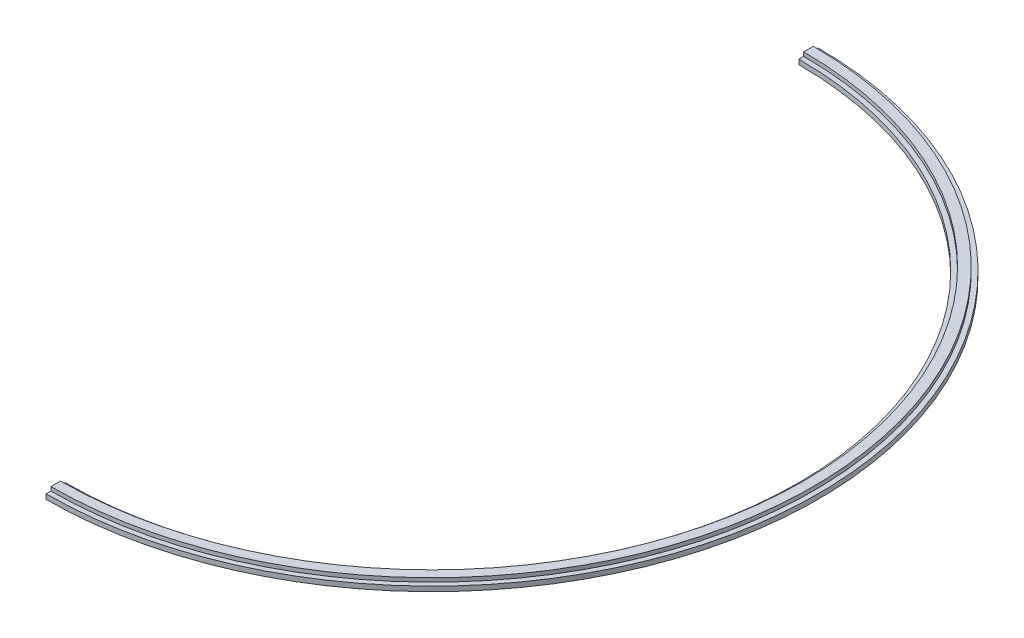
ISO-10303-21;
HEADER;
FILE_DESCRIPTION(('STEP AP214'),'2;1');
FILE_NAME('part.step','',(''),(''),'','','');
FILE_SCHEMA(('AUTOMOTIVE_DESIGN { 1 0 10303 214 1 1 1 1 }'));
ENDSEC;
DATA;
#1=APPLICATION_CONTEXT('core data for automotive mechanical design processes');
#2=APPLICATION_PROTOCOL_DEFINITION('international standard','automotive_design',2000,#1);
#3=PRODUCT_CONTEXT('',#1,'mechanical');
#4=PRODUCT('Part','Part','',(#3));
#5=PRODUCT_RELATED_PRODUCT_CATEGORY('part','',(#4));
#6=PRODUCT_DEFINITION_FORMATION('','',#4);
#7=PRODUCT_DEFINITION_CONTEXT('part definition',#1,'design');
#8=PRODUCT_DEFINITION('design','',#6,#7);
#9=PRODUCT_DEFINITION_SHAPE('','',#8);
#10=(LENGTH_UNIT() NAMED_UNIT(*) SI_UNIT(.MILLI.,.METRE.));
#11=(NAMED_UNIT(*) PLANE_ANGLE_UNIT() SI_UNIT($,.RADIAN.));
#12=(NAMED_UNIT(*) SI_UNIT($,.STERADIAN.) SOLID_ANGLE_UNIT());
#13=UNCERTAINTY_MEASURE_WITH_UNIT(LENGTH_MEASURE(1.E-05),#10,'distance_accuracy_value','');
#14=(GEOMETRIC_REPRESENTATION_CONTEXT(3) GLOBAL_UNCERTAINTY_ASSIGNED_CONTEXT((#13)) GLOBAL_UNIT_ASSIGNED_CONTEXT((#10,
#11,#12)) REPRESENTATION_CONTEXT('',''));
#15=CARTESIAN_POINT('',(0.,0.,0.));
#16=DIRECTION('',(0.,0.,1.));
#17=DIRECTION('',(1.,0.,0.));
#18=AXIS2_PLACEMENT_3D('',#15,#16,#17);
#19=CARTESIAN_POINT('',(0.,50.,0.));
#20=DIRECTION('',(0.,1.,0.));
#21=DIRECTION('',(0.,0.,1.));
#22=AXIS2_PLACEMENT_3D('',#19,#20,#21);
#23=PLANE('',#22);
#24=DIRECTION('',(0.,0.,1.));
#25=VECTOR('',#24,1.);
#26=CARTESIAN_POINT('',(0.,50.,0.));
#27=LINE('',#26,#25);
#28=CARTESIAN_POINT('',(0.,50.,3800.));
#29=VERTEX_POINT('',#28);
#30=CARTESIAN_POINT('',(0.,50.,3850.));
#31=VERTEX_POINT('',#30);
#32=EDGE_CURVE('E139',#29,#31,#27,.T.);
#33=ORIENTED_EDGE('',*,*,#32,.T.);
#34=CARTESIAN_POINT('',(0.,50.,0.));
#35=DIRECTION('',(0.,1.,0.));
#36=DIRECTION('',(0.,0.,1.));
#37=AXIS2_PLACEMENT_3D('',#34,#35,#36);
#38=CIRCLE('',#37,3850.);
#39=CARTESIAN_POINT('',(0.,50.,-3850.));
#40=VERTEX_POINT('',#39);
#41=EDGE_CURVE('E50',#31,#40,#38,.T.);
#42=ORIENTED_EDGE('',*,*,#41,.T.);
#43=CARTESIAN_POINT('',(0.,50.,-3800.));
#44=VERTEX_POINT('',#43);
#45=EDGE_CURVE('E142',#40,#44,#27,.T.);
#46=ORIENTED_EDGE('',*,*,#45,.T.);
#47=CARTESIAN_POINT('',(0.,50.,0.));
#48=DIRECTION('',(0.,1.,0.));
#49=DIRECTION('',(0.,0.,1.));
#50=AXIS2_PLACEMENT_3D('',#47,#48,#49);
#51=CIRCLE('',#50,3800.);
#52=EDGE_CURVE('E134',#29,#44,#51,.T.);
#53=ORIENTED_EDGE('',*,*,#52,.F.);
#54=EDGE_LOOP('',(#33,#42,#46,#53));
#55=FACE_BOUND('',#54,.T.);
#56=ADVANCED_FACE('F35',(#55),#23,.T.);
#57=CARTESIAN_POINT('',(0.,50.,0.));
#58=DIRECTION('',(0.,-1.,0.));
#59=DIRECTION('',(0.,0.,-1.));
#60=AXIS2_PLACEMENT_3D('',#57,#58,#59);
#61=CYLINDRICAL_SURFACE('',#60,3800.);
#62=CARTESIAN_POINT('',(0.,0.,0.));
#63=DIRECTION('',(0.,1.,0.));
#64=DIRECTION('',(0.,0.,1.));
#65=AXIS2_PLACEMENT_3D('',#62,#63,#64);
#66=CIRCLE('',#65,3800.);
#67=CARTESIAN_POINT('',(0.,0.,3800.));
#68=VERTEX_POINT('',#67);
#69=CARTESIAN_POINT('',(0.,0.,-3800.));
#70=VERTEX_POINT('',#69);
#71=EDGE_CURVE('E107',#68,#70,#66,.T.);
#72=ORIENTED_EDGE('',*,*,#71,.F.);
#73=DIRECTION('',(0.,-1.,0.));
#74=VECTOR('',#73,1.);
#75=CARTESIAN_POINT('',(0.,50.,3800.));
#76=LINE('',#75,#74);
#77=EDGE_CURVE('E11',#29,#68,#76,.T.);
#78=ORIENTED_EDGE('',*,*,#77,.F.);
#79=ORIENTED_EDGE('',*,*,#52,.T.);
#80=DIRECTION('',(0.,-1.,0.));
#81=VECTOR('',#80,1.);
#82=CARTESIAN_POINT('',(0.,50.,-3800.));
#83=LINE('',#82,#81);
#84=EDGE_CURVE('E151',#44,#70,#83,.T.);
#85=ORIENTED_EDGE('',*,*,#84,.T.);
#86=EDGE_LOOP('',(#72,#78,#79,#85));
#87=FACE_BOUND('',#86,.T.);
#88=ADVANCED_FACE('F37',(#87),#61,.F.);
#89=CARTESIAN_POINT('',(0.,50.,0.));
#90=DIRECTION('',(1.,0.,0.));
#91=DIRECTION('',(0.,0.,-1.));
#92=AXIS2_PLACEMENT_3D('',#89,#90,#91);
#93=PLANE('',#92);
#94=DIRECTION('',(0.,0.,1.));
#95=VECTOR('',#94,1.);
#96=CARTESIAN_POINT('',(0.,0.,0.));
#97=LINE('',#96,#95);
#98=CARTESIAN_POINT('',(0.,0.,4000.));
#99=VERTEX_POINT('',#98);
#100=EDGE_CURVE('E147',#68,#99,#97,.T.);
#101=ORIENTED_EDGE('',*,*,#100,.T.);
#102=DIRECTION('',(0.,-1.,0.));
#103=VECTOR('',#102,1.);
#104=CARTESIAN_POINT('',(0.,50.,4000.));
#105=LINE('',#104,#103);
#106=CARTESIAN_POINT('',(0.,50.,4000.));
#107=VERTEX_POINT('',#106);
#108=EDGE_CURVE('E43',#107,#99,#105,.T.);
#109=ORIENTED_EDGE('',*,*,#108,.F.);
#110=CARTESIAN_POINT('',(0.,50.,3950.));
#111=VERTEX_POINT('',#110);
#112=EDGE_CURVE('E137',#111,#107,#27,.T.);
#113=ORIENTED_EDGE('',*,*,#112,.F.);
#114=DIRECTION('',(0.,-1.,0.));
#115=VECTOR('',#114,1.);
#116=CARTESIAN_POINT('',(0.,90.,3950.));
#117=LINE('',#116,#115);
#118=CARTESIAN_POINT('',(0.,90.,3950.));
#119=VERTEX_POINT('',#118);
#120=EDGE_CURVE('E108',#119,#111,#117,.T.);
#121=ORIENTED_EDGE('',*,*,#120,.F.);
#122=DIRECTION('',(0.,0.,1.));
#123=VECTOR('',#122,1.);
#124=CARTESIAN_POINT('',(0.,90.,0.));
#125=LINE('',#124,#123);
#126=CARTESIAN_POINT('',(0.,90.,3850.));
#127=VERTEX_POINT('',#126);
#128=EDGE_CURVE('E111',#127,#119,#125,.T.);
#129=ORIENTED_EDGE('',*,*,#128,.F.);
#130=DIRECTION('',(0.,-1.,0.));
#131=VECTOR('',#130,1.);
#132=CARTESIAN_POINT('',(0.,90.,3850.));
#133=LINE('',#132,#131);
#134=EDGE_CURVE('E99',#127,#31,#133,.T.);
#135=ORIENTED_EDGE('',*,*,#134,.T.);
#136=ORIENTED_EDGE('',*,*,#32,.F.);
#137=ORIENTED_EDGE('',*,*,#77,.T.);
#138=EDGE_LOOP('',(#101,#109,#113,#121,#129,#135,#136,#137));
#139=FACE_BOUND('',#138,.T.);
#140=ADVANCED_FACE('F112',(#139),#93,.F.);
#141=CARTESIAN_POINT('',(0.,50.,0.));
#142=DIRECTION('',(0.,-1.,0.));
#143=DIRECTION('',(0.,0.,-1.));
#144=AXIS2_PLACEMENT_3D('',#141,#142,#143);
#145=CYLINDRICAL_SURFACE('',#144,4000.);
#146=CARTESIAN_POINT('',(0.,0.,0.));
#147=DIRECTION('',(0.,1.,0.));
#148=DIRECTION('',(0.,0.,1.));
#149=AXIS2_PLACEMENT_3D('',#146,#147,#148);
#150=CIRCLE('',#149,4000.);
#151=CARTESIAN_POINT('',(0.,0.,-4000.));
#152=VERTEX_POINT('',#151);
#153=EDGE_CURVE('E149',#99,#152,#150,.T.);
#154=ORIENTED_EDGE('',*,*,#153,.T.);
#155=DIRECTION('',(0.,-1.,0.));
#156=VECTOR('',#155,1.);
#157=CARTESIAN_POINT('',(0.,50.,-4000.));
#158=LINE('',#157,#156);
#159=CARTESIAN_POINT('',(0.,50.,-4000.));
#160=VERTEX_POINT('',#159);
#161=EDGE_CURVE('E153',#160,#152,#158,.T.);
#162=ORIENTED_EDGE('',*,*,#161,.F.);
#163=CARTESIAN_POINT('',(0.,50.,0.));
#164=DIRECTION('',(0.,1.,0.));
#165=DIRECTION('',(0.,0.,1.));
#166=AXIS2_PLACEMENT_3D('',#163,#164,#165);
#167=CIRCLE('',#166,4000.);
#168=EDGE_CURVE('E141',#107,#160,#167,.T.);
#169=ORIENTED_EDGE('',*,*,#168,.F.);
#170=ORIENTED_EDGE('',*,*,#108,.T.);
#171=EDGE_LOOP('',(#154,#162,#169,#170));
#172=FACE_BOUND('',#171,.T.);
#173=ADVANCED_FACE('F160',(#172),#145,.T.);
#174=EDGE_CURVE('E138',#152,#70,#97,.T.);
#175=ORIENTED_EDGE('',*,*,#174,.T.);
#176=ORIENTED_EDGE('',*,*,#84,.F.);
#177=ORIENTED_EDGE('',*,*,#45,.F.);
#178=DIRECTION('',(0.,-1.,0.));
#179=VECTOR('',#178,1.);
#180=CARTESIAN_POINT('',(0.,90.,-3850.));
#181=LINE('',#180,#179);
#182=CARTESIAN_POINT('',(0.,90.,-3850.));
#183=VERTEX_POINT('',#182);
#184=EDGE_CURVE('E127',#183,#40,#181,.T.);
#185=ORIENTED_EDGE('',*,*,#184,.F.);
#186=DIRECTION('',(0.,0.,1.));
#187=VECTOR('',#186,1.);
#188=CARTESIAN_POINT('',(0.,90.,0.));
#189=LINE('',#188,#187);
#190=CARTESIAN_POINT('',(0.,90.,-3950.));
#191=VERTEX_POINT('',#190);
#192=EDGE_CURVE('E120',#191,#183,#189,.T.);
#193=ORIENTED_EDGE('',*,*,#192,.F.);
#194=DIRECTION('',(0.,-1.,0.));
#195=VECTOR('',#194,1.);
#196=CARTESIAN_POINT('',(0.,90.,-3950.));
#197=LINE('',#196,#195);
#198=CARTESIAN_POINT('',(0.,50.,-3950.));
#199=VERTEX_POINT('',#198);
#200=EDGE_CURVE('E130',#191,#199,#197,.T.);
#201=ORIENTED_EDGE('',*,*,#200,.T.);
#202=EDGE_CURVE('E143',#160,#199,#27,.T.);
#203=ORIENTED_EDGE('',*,*,#202,.F.);
#204=ORIENTED_EDGE('',*,*,#161,.T.);
#205=EDGE_LOOP('',(#175,#176,#177,#185,#193,#201,#203,#204));
#206=FACE_BOUND('',#205,.T.);
#207=ADVANCED_FACE('F170',(#206),#93,.F.);
#208=CARTESIAN_POINT('',(0.,50.,0.));
#209=DIRECTION('',(0.,1.,0.));
#210=DIRECTION('',(0.,0.,1.));
#211=AXIS2_PLACEMENT_3D('',#208,#209,#210);
#212=CIRCLE('',#211,3950.);
#213=EDGE_CURVE('E58',#111,#199,#212,.T.);
#214=ORIENTED_EDGE('',*,*,#213,.F.);
#215=ORIENTED_EDGE('',*,*,#112,.T.);
#216=ORIENTED_EDGE('',*,*,#168,.T.);
#217=ORIENTED_EDGE('',*,*,#202,.T.);
#218=EDGE_LOOP('',(#214,#215,#216,#217));
#219=FACE_BOUND('',#218,.T.);
#220=ADVANCED_FACE('F173',(#219),#23,.T.);
#221=CARTESIAN_POINT('',(0.,0.,0.));
#222=DIRECTION('',(0.,1.,0.));
#223=DIRECTION('',(0.,0.,1.));
#224=AXIS2_PLACEMENT_3D('',#221,#222,#223);
#225=PLANE('',#224);
#226=ORIENTED_EDGE('',*,*,#71,.T.);
#227=ORIENTED_EDGE('',*,*,#174,.F.);
#228=ORIENTED_EDGE('',*,*,#153,.F.);
#229=ORIENTED_EDGE('',*,*,#100,.F.);
#230=EDGE_LOOP('',(#226,#227,#228,#229));
#231=FACE_BOUND('',#230,.T.);
#232=ADVANCED_FACE('F165',(#231),#225,.F.);
#233=CARTESIAN_POINT('',(0.,90.,0.));
#234=DIRECTION('',(0.,-1.,0.));
#235=DIRECTION('',(0.,0.,-1.));
#236=AXIS2_PLACEMENT_3D('',#233,#234,#235);
#237=CYLINDRICAL_SURFACE('',#236,3850.);
#238=ORIENTED_EDGE('',*,*,#41,.F.);
#239=ORIENTED_EDGE('',*,*,#134,.F.);
#240=CARTESIAN_POINT('',(0.,90.,0.));
#241=DIRECTION('',(0.,1.,0.));
#242=DIRECTION('',(0.,0.,1.));
#243=AXIS2_PLACEMENT_3D('',#240,#241,#242);
#244=CIRCLE('',#243,3850.);
#245=EDGE_CURVE('E104',#127,#183,#244,.T.);
#246=ORIENTED_EDGE('',*,*,#245,.T.);
#247=ORIENTED_EDGE('',*,*,#184,.T.);
#248=EDGE_LOOP('',(#238,#239,#246,#247));
#249=FACE_BOUND('',#248,.T.);
#250=ADVANCED_FACE('F101',(#249),#237,.F.);
#251=CARTESIAN_POINT('',(0.,90.,0.));
#252=DIRECTION('',(0.,-1.,0.));
#253=DIRECTION('',(0.,0.,-1.));
#254=AXIS2_PLACEMENT_3D('',#251,#252,#253);
#255=CYLINDRICAL_SURFACE('',#254,3950.);
#256=ORIENTED_EDGE('',*,*,#213,.T.);
#257=ORIENTED_EDGE('',*,*,#200,.F.);
#258=CARTESIAN_POINT('',(0.,90.,0.));
#259=DIRECTION('',(0.,1.,0.));
#260=DIRECTION('',(0.,0.,1.));
#261=AXIS2_PLACEMENT_3D('',#258,#259,#260);
#262=CIRCLE('',#261,3950.);
#263=EDGE_CURVE('E116',#119,#191,#262,.T.);
#264=ORIENTED_EDGE('',*,*,#263,.F.);
#265=ORIENTED_EDGE('',*,*,#120,.T.);
#266=EDGE_LOOP('',(#256,#257,#264,#265));
#267=FACE_BOUND('',#266,.T.);
#268=ADVANCED_FACE('F175',(#267),#255,.T.);
#269=CARTESIAN_POINT('',(0.,90.,0.));
#270=DIRECTION('',(0.,1.,0.));
#271=DIRECTION('',(0.,0.,1.));
#272=AXIS2_PLACEMENT_3D('',#269,#270,#271);
#273=PLANE('',#272);
#274=ORIENTED_EDGE('',*,*,#245,.F.);
#275=ORIENTED_EDGE('',*,*,#128,.T.);
#276=ORIENTED_EDGE('',*,*,#263,.T.);
#277=ORIENTED_EDGE('',*,*,#192,.T.);
#278=EDGE_LOOP('',(#274,#275,#276,#277));
#279=FACE_BOUND('',#278,.T.);
#280=ADVANCED_FACE('F118',(#279),#273,.T.);
#281=CLOSED_SHELL('',(#56,#88,#140,#173,#207,#220,#232,#250,#268,#280));
#282=MANIFOLD_SOLID_BREP('B2',#281);
#283=ADVANCED_BREP_SHAPE_REPRESENTATION('',(#18,#282),#14);
#284=SHAPE_DEFINITION_REPRESENTATION(#9,#283);
ENDSEC;
END-ISO-10303-21;
